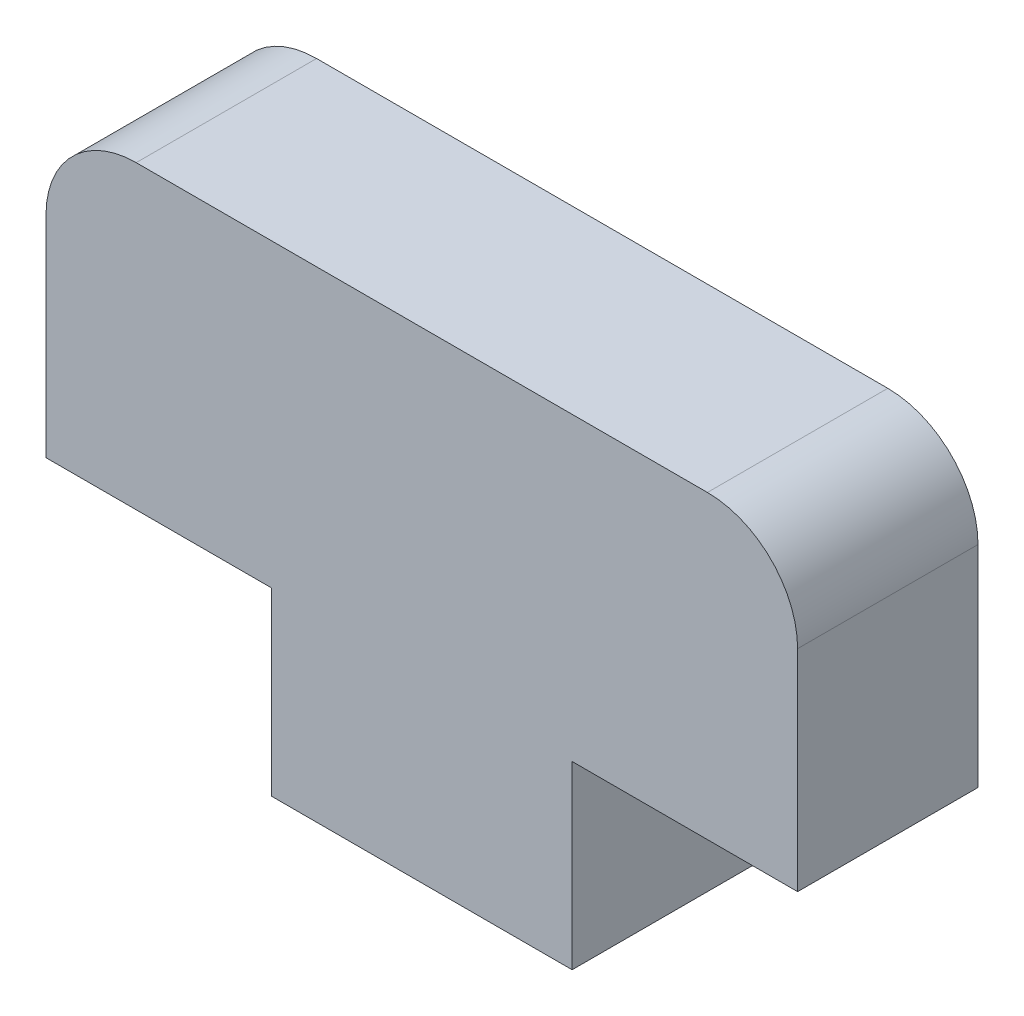
ISO-10303-21;
HEADER;
FILE_DESCRIPTION(('STEP AP214'),'2;1');
FILE_NAME('part.step','',(''),(''),'','','');
FILE_SCHEMA(('AUTOMOTIVE_DESIGN { 1 0 10303 214 1 1 1 1 }'));
ENDSEC;
DATA;
#1=APPLICATION_CONTEXT('core data for automotive mechanical design processes');
#2=APPLICATION_PROTOCOL_DEFINITION('international standard','automotive_design',2000,#1);
#3=PRODUCT_CONTEXT('',#1,'mechanical');
#4=PRODUCT('Part','Part','',(#3));
#5=PRODUCT_RELATED_PRODUCT_CATEGORY('part','',(#4));
#6=PRODUCT_DEFINITION_FORMATION('','',#4);
#7=PRODUCT_DEFINITION_CONTEXT('part definition',#1,'design');
#8=PRODUCT_DEFINITION('design','',#6,#7);
#9=PRODUCT_DEFINITION_SHAPE('','',#8);
#10=(LENGTH_UNIT() NAMED_UNIT(*) SI_UNIT(.MILLI.,.METRE.));
#11=(NAMED_UNIT(*) PLANE_ANGLE_UNIT() SI_UNIT($,.RADIAN.));
#12=(NAMED_UNIT(*) SI_UNIT($,.STERADIAN.) SOLID_ANGLE_UNIT());
#13=UNCERTAINTY_MEASURE_WITH_UNIT(LENGTH_MEASURE(1.E-05),#10,'distance_accuracy_value','');
#14=(GEOMETRIC_REPRESENTATION_CONTEXT(3) GLOBAL_UNCERTAINTY_ASSIGNED_CONTEXT((#13)) GLOBAL_UNIT_ASSIGNED_CONTEXT((#10,
#11,#12)) REPRESENTATION_CONTEXT('',''));
#15=CARTESIAN_POINT('',(0.,0.,0.));
#16=DIRECTION('',(0.,0.,1.));
#17=DIRECTION('',(1.,0.,0.));
#18=AXIS2_PLACEMENT_3D('',#15,#16,#17);
#19=CARTESIAN_POINT('',(12.5,5.,6.));
#20=DIRECTION('',(-1.,0.,0.));
#21=DIRECTION('',(0.,0.,1.));
#22=AXIS2_PLACEMENT_3D('',#19,#20,#21);
#23=PLANE('',#22);
#24=DIRECTION('',(0.,1.,0.));
#25=VECTOR('',#24,1.);
#26=CARTESIAN_POINT('',(12.5,5.,0.));
#27=LINE('',#26,#25);
#28=CARTESIAN_POINT('',(12.5,-5.,0.));
#29=VERTEX_POINT('',#28);
#30=CARTESIAN_POINT('',(12.5,2.,0.));
#31=VERTEX_POINT('',#30);
#32=EDGE_CURVE('E145',#29,#31,#27,.T.);
#33=ORIENTED_EDGE('',*,*,#32,.T.);
#34=DIRECTION('',(0.,0.,-1.));
#35=VECTOR('',#34,1.);
#36=CARTESIAN_POINT('',(12.5,2.,6.));
#37=LINE('',#36,#35);
#38=CARTESIAN_POINT('',(12.5,2.,6.));
#39=VERTEX_POINT('',#38);
#40=EDGE_CURVE('E56',#31,#39,#37,.F.);
#41=ORIENTED_EDGE('',*,*,#40,.T.);
#42=DIRECTION('',(0.,1.,0.));
#43=VECTOR('',#42,1.);
#44=CARTESIAN_POINT('',(12.5,5.,6.));
#45=LINE('',#44,#43);
#46=CARTESIAN_POINT('',(12.5,-5.,6.));
#47=VERTEX_POINT('',#46);
#48=EDGE_CURVE('E161',#47,#39,#45,.T.);
#49=ORIENTED_EDGE('',*,*,#48,.F.);
#50=DIRECTION('',(0.,0.,-1.));
#51=VECTOR('',#50,1.);
#52=CARTESIAN_POINT('',(12.5,-5.,6.));
#53=LINE('',#52,#51);
#54=EDGE_CURVE('E144',#47,#29,#53,.T.);
#55=ORIENTED_EDGE('',*,*,#54,.T.);
#56=EDGE_LOOP('',(#33,#41,#49,#55));
#57=FACE_BOUND('',#56,.T.);
#58=ADVANCED_FACE('F33',(#57),#23,.F.);
#59=CARTESIAN_POINT('',(-12.5,5.,6.));
#60=DIRECTION('',(0.,-1.,0.));
#61=DIRECTION('',(0.,0.,-1.));
#62=AXIS2_PLACEMENT_3D('',#59,#60,#61);
#63=PLANE('',#62);
#64=DIRECTION('',(-1.,0.,0.));
#65=VECTOR('',#64,1.);
#66=CARTESIAN_POINT('',(-12.5,5.,6.));
#67=LINE('',#66,#65);
#68=CARTESIAN_POINT('',(9.49999999999999,5.,6.));
#69=VERTEX_POINT('',#68);
#70=CARTESIAN_POINT('',(-9.50000000000001,5.,6.));
#71=VERTEX_POINT('',#70);
#72=EDGE_CURVE('E118',#69,#71,#67,.T.);
#73=ORIENTED_EDGE('',*,*,#72,.F.);
#74=DIRECTION('',(0.,0.,-1.));
#75=VECTOR('',#74,1.);
#76=CARTESIAN_POINT('',(9.49999999999999,5.,6.));
#77=LINE('',#76,#75);
#78=CARTESIAN_POINT('',(9.49999999999999,5.,0.));
#79=VERTEX_POINT('',#78);
#80=EDGE_CURVE('E175',#69,#79,#77,.T.);
#81=ORIENTED_EDGE('',*,*,#80,.T.);
#82=DIRECTION('',(-1.,0.,0.));
#83=VECTOR('',#82,1.);
#84=CARTESIAN_POINT('',(-12.5,5.,0.));
#85=LINE('',#84,#83);
#86=CARTESIAN_POINT('',(-9.50000000000001,5.,0.));
#87=VERTEX_POINT('',#86);
#88=EDGE_CURVE('E147',#79,#87,#85,.T.);
#89=ORIENTED_EDGE('',*,*,#88,.T.);
#90=DIRECTION('',(0.,0.,-1.));
#91=VECTOR('',#90,1.);
#92=CARTESIAN_POINT('',(-9.50000000000001,5.,6.));
#93=LINE('',#92,#91);
#94=EDGE_CURVE('E127',#87,#71,#93,.F.);
#95=ORIENTED_EDGE('',*,*,#94,.T.);
#96=EDGE_LOOP('',(#73,#81,#89,#95));
#97=FACE_BOUND('',#96,.T.);
#98=ADVANCED_FACE('F188',(#97),#63,.F.);
#99=CARTESIAN_POINT('',(-12.5,5.,6.));
#100=DIRECTION('',(1.,0.,0.));
#101=DIRECTION('',(0.,1.,0.));
#102=AXIS2_PLACEMENT_3D('',#99,#100,#101);
#103=PLANE('',#102);
#104=DIRECTION('',(0.,-1.,0.));
#105=VECTOR('',#104,1.);
#106=CARTESIAN_POINT('',(-12.5,5.,6.));
#107=LINE('',#106,#105);
#108=CARTESIAN_POINT('',(-12.5,2.,6.));
#109=VERTEX_POINT('',#108);
#110=CARTESIAN_POINT('',(-12.5,-5.,6.));
#111=VERTEX_POINT('',#110);
#112=EDGE_CURVE('E110',#109,#111,#107,.T.);
#113=ORIENTED_EDGE('',*,*,#112,.F.);
#114=DIRECTION('',(0.,0.,-1.));
#115=VECTOR('',#114,1.);
#116=CARTESIAN_POINT('',(-12.5,2.,6.));
#117=LINE('',#116,#115);
#118=CARTESIAN_POINT('',(-12.5,2.,0.));
#119=VERTEX_POINT('',#118);
#120=EDGE_CURVE('E11',#109,#119,#117,.T.);
#121=ORIENTED_EDGE('',*,*,#120,.T.);
#122=DIRECTION('',(0.,-1.,0.));
#123=VECTOR('',#122,1.);
#124=CARTESIAN_POINT('',(-12.5,5.,0.));
#125=LINE('',#124,#123);
#126=CARTESIAN_POINT('',(-12.5,-5.,0.));
#127=VERTEX_POINT('',#126);
#128=EDGE_CURVE('E124',#119,#127,#125,.T.);
#129=ORIENTED_EDGE('',*,*,#128,.T.);
#130=DIRECTION('',(0.,0.,-1.));
#131=VECTOR('',#130,1.);
#132=CARTESIAN_POINT('',(-12.5,-5.,6.));
#133=LINE('',#132,#131);
#134=EDGE_CURVE('E121',#111,#127,#133,.T.);
#135=ORIENTED_EDGE('',*,*,#134,.F.);
#136=EDGE_LOOP('',(#113,#121,#129,#135));
#137=FACE_BOUND('',#136,.T.);
#138=ADVANCED_FACE('F122',(#137),#103,.F.);
#139=CARTESIAN_POINT('',(-12.5,-5.,6.));
#140=DIRECTION('',(0.,1.,0.));
#141=DIRECTION('',(0.,0.,1.));
#142=AXIS2_PLACEMENT_3D('',#139,#140,#141);
#143=PLANE('',#142);
#144=DIRECTION('',(1.,0.,0.));
#145=VECTOR('',#144,1.);
#146=CARTESIAN_POINT('',(-12.5,-5.,0.));
#147=LINE('',#146,#145);
#148=CARTESIAN_POINT('',(-5.,-5.,0.));
#149=VERTEX_POINT('',#148);
#150=EDGE_CURVE('E151',#127,#149,#147,.T.);
#151=ORIENTED_EDGE('',*,*,#150,.T.);
#152=DIRECTION('',(0.,0.,-1.));
#153=VECTOR('',#152,1.);
#154=CARTESIAN_POINT('',(-5.,-5.,6.));
#155=LINE('',#154,#153);
#156=CARTESIAN_POINT('',(-5.,-5.,6.));
#157=VERTEX_POINT('',#156);
#158=EDGE_CURVE('E128',#157,#149,#155,.T.);
#159=ORIENTED_EDGE('',*,*,#158,.F.);
#160=DIRECTION('',(1.,0.,0.));
#161=VECTOR('',#160,1.);
#162=CARTESIAN_POINT('',(-12.5,-5.,6.));
#163=LINE('',#162,#161);
#164=EDGE_CURVE('E114',#111,#157,#163,.T.);
#165=ORIENTED_EDGE('',*,*,#164,.F.);
#166=ORIENTED_EDGE('',*,*,#134,.T.);
#167=EDGE_LOOP('',(#151,#159,#165,#166));
#168=FACE_BOUND('',#167,.T.);
#169=ADVANCED_FACE('F130',(#168),#143,.F.);
#170=CARTESIAN_POINT('',(-5.,-5.,6.));
#171=DIRECTION('',(1.,0.,0.));
#172=DIRECTION('',(0.,1.,0.));
#173=AXIS2_PLACEMENT_3D('',#170,#171,#172);
#174=PLANE('',#173);
#175=DIRECTION('',(0.,-1.,0.));
#176=VECTOR('',#175,1.);
#177=CARTESIAN_POINT('',(-5.,-5.,0.));
#178=LINE('',#177,#176);
#179=CARTESIAN_POINT('',(-5.,-11.,0.));
#180=VERTEX_POINT('',#179);
#181=EDGE_CURVE('E153',#149,#180,#178,.T.);
#182=ORIENTED_EDGE('',*,*,#181,.T.);
#183=DIRECTION('',(0.,0.,-1.));
#184=VECTOR('',#183,1.);
#185=CARTESIAN_POINT('',(-5.,-11.,6.));
#186=LINE('',#185,#184);
#187=CARTESIAN_POINT('',(-5.,-11.,6.));
#188=VERTEX_POINT('',#187);
#189=EDGE_CURVE('E170',#188,#180,#186,.T.);
#190=ORIENTED_EDGE('',*,*,#189,.F.);
#191=DIRECTION('',(0.,-1.,0.));
#192=VECTOR('',#191,1.);
#193=CARTESIAN_POINT('',(-5.,-5.,6.));
#194=LINE('',#193,#192);
#195=EDGE_CURVE('E133',#157,#188,#194,.T.);
#196=ORIENTED_EDGE('',*,*,#195,.F.);
#197=ORIENTED_EDGE('',*,*,#158,.T.);
#198=EDGE_LOOP('',(#182,#190,#196,#197));
#199=FACE_BOUND('',#198,.T.);
#200=ADVANCED_FACE('F213',(#199),#174,.F.);
#201=CARTESIAN_POINT('',(-5.,-11.,6.));
#202=DIRECTION('',(0.,1.,0.));
#203=DIRECTION('',(-1.,0.,0.));
#204=AXIS2_PLACEMENT_3D('',#201,#202,#203);
#205=PLANE('',#204);
#206=DIRECTION('',(1.,0.,0.));
#207=VECTOR('',#206,1.);
#208=CARTESIAN_POINT('',(-5.,-11.,0.));
#209=LINE('',#208,#207);
#210=CARTESIAN_POINT('',(5.,-11.,0.));
#211=VERTEX_POINT('',#210);
#212=EDGE_CURVE('E155',#180,#211,#209,.T.);
#213=ORIENTED_EDGE('',*,*,#212,.T.);
#214=DIRECTION('',(0.,0.,-1.));
#215=VECTOR('',#214,1.);
#216=CARTESIAN_POINT('',(5.,-11.,6.));
#217=LINE('',#216,#215);
#218=CARTESIAN_POINT('',(5.,-11.,6.));
#219=VERTEX_POINT('',#218);
#220=EDGE_CURVE('E167',#219,#211,#217,.T.);
#221=ORIENTED_EDGE('',*,*,#220,.F.);
#222=DIRECTION('',(1.,0.,0.));
#223=VECTOR('',#222,1.);
#224=CARTESIAN_POINT('',(-5.,-11.,6.));
#225=LINE('',#224,#223);
#226=EDGE_CURVE('E135',#188,#219,#225,.T.);
#227=ORIENTED_EDGE('',*,*,#226,.F.);
#228=ORIENTED_EDGE('',*,*,#189,.T.);
#229=EDGE_LOOP('',(#213,#221,#227,#228));
#230=FACE_BOUND('',#229,.T.);
#231=ADVANCED_FACE('F210',(#230),#205,.F.);
#232=CARTESIAN_POINT('',(5.,-5.,6.));
#233=DIRECTION('',(-1.,0.,0.));
#234=DIRECTION('',(0.,-1.,0.));
#235=AXIS2_PLACEMENT_3D('',#232,#233,#234);
#236=PLANE('',#235);
#237=DIRECTION('',(0.,1.,0.));
#238=VECTOR('',#237,1.);
#239=CARTESIAN_POINT('',(5.,-5.,0.));
#240=LINE('',#239,#238);
#241=CARTESIAN_POINT('',(5.,-5.,0.));
#242=VERTEX_POINT('',#241);
#243=EDGE_CURVE('E157',#211,#242,#240,.T.);
#244=ORIENTED_EDGE('',*,*,#243,.T.);
#245=DIRECTION('',(0.,0.,-1.));
#246=VECTOR('',#245,1.);
#247=CARTESIAN_POINT('',(5.,-5.,6.));
#248=LINE('',#247,#246);
#249=CARTESIAN_POINT('',(5.,-5.,6.));
#250=VERTEX_POINT('',#249);
#251=EDGE_CURVE('E164',#250,#242,#248,.T.);
#252=ORIENTED_EDGE('',*,*,#251,.F.);
#253=DIRECTION('',(0.,1.,0.));
#254=VECTOR('',#253,1.);
#255=CARTESIAN_POINT('',(5.,-5.,6.));
#256=LINE('',#255,#254);
#257=EDGE_CURVE('E140',#219,#250,#256,.T.);
#258=ORIENTED_EDGE('',*,*,#257,.F.);
#259=ORIENTED_EDGE('',*,*,#220,.T.);
#260=EDGE_LOOP('',(#244,#252,#258,#259));
#261=FACE_BOUND('',#260,.T.);
#262=ADVANCED_FACE('F205',(#261),#236,.F.);
#263=CARTESIAN_POINT('',(5.,-5.,6.));
#264=DIRECTION('',(0.,1.,0.));
#265=DIRECTION('',(0.,0.,1.));
#266=AXIS2_PLACEMENT_3D('',#263,#264,#265);
#267=PLANE('',#266);
#268=DIRECTION('',(1.,0.,0.));
#269=VECTOR('',#268,1.);
#270=CARTESIAN_POINT('',(5.,-5.,0.));
#271=LINE('',#270,#269);
#272=EDGE_CURVE('E159',#242,#29,#271,.T.);
#273=ORIENTED_EDGE('',*,*,#272,.T.);
#274=ORIENTED_EDGE('',*,*,#54,.F.);
#275=DIRECTION('',(1.,0.,0.));
#276=VECTOR('',#275,1.);
#277=CARTESIAN_POINT('',(5.,-5.,6.));
#278=LINE('',#277,#276);
#279=EDGE_CURVE('E142',#250,#47,#278,.T.);
#280=ORIENTED_EDGE('',*,*,#279,.F.);
#281=ORIENTED_EDGE('',*,*,#251,.T.);
#282=EDGE_LOOP('',(#273,#274,#280,#281));
#283=FACE_BOUND('',#282,.T.);
#284=ADVANCED_FACE('F199',(#283),#267,.F.);
#285=CARTESIAN_POINT('',(0.,0.,6.));
#286=DIRECTION('',(0.,0.,1.));
#287=DIRECTION('',(1.,0.,0.));
#288=AXIS2_PLACEMENT_3D('',#285,#286,#287);
#289=PLANE('',#288);
#290=ORIENTED_EDGE('',*,*,#48,.T.);
#291=CARTESIAN_POINT('',(9.49999999999999,2.,6.));
#292=DIRECTION('',(0.,0.,1.));
#293=DIRECTION('',(1.,0.,0.));
#294=AXIS2_PLACEMENT_3D('',#291,#292,#293);
#295=CIRCLE('',#294,3.);
#296=EDGE_CURVE('E41',#39,#69,#295,.T.);
#297=ORIENTED_EDGE('',*,*,#296,.T.);
#298=ORIENTED_EDGE('',*,*,#72,.T.);
#299=CARTESIAN_POINT('',(-9.50000000000001,2.,6.));
#300=DIRECTION('',(0.,0.,1.));
#301=DIRECTION('',(1.,0.,0.));
#302=AXIS2_PLACEMENT_3D('',#299,#300,#301);
#303=CIRCLE('',#302,3.);
#304=EDGE_CURVE('E48',#71,#109,#303,.T.);
#305=ORIENTED_EDGE('',*,*,#304,.T.);
#306=ORIENTED_EDGE('',*,*,#112,.T.);
#307=ORIENTED_EDGE('',*,*,#164,.T.);
#308=ORIENTED_EDGE('',*,*,#195,.T.);
#309=ORIENTED_EDGE('',*,*,#226,.T.);
#310=ORIENTED_EDGE('',*,*,#257,.T.);
#311=ORIENTED_EDGE('',*,*,#279,.T.);
#312=EDGE_LOOP('',(#290,#297,#298,#305,#306,#307,#308,#309,#310,#311));
#313=FACE_BOUND('',#312,.T.);
#314=ADVANCED_FACE('F112',(#313),#289,.T.);
#315=CARTESIAN_POINT('',(0.,0.,0.));
#316=DIRECTION('',(0.,0.,1.));
#317=DIRECTION('',(1.,0.,0.));
#318=AXIS2_PLACEMENT_3D('',#315,#316,#317);
#319=PLANE('',#318);
#320=ORIENTED_EDGE('',*,*,#88,.F.);
#321=CARTESIAN_POINT('',(9.49999999999999,2.,0.));
#322=DIRECTION('',(0.,0.,1.));
#323=DIRECTION('',(1.,0.,0.));
#324=AXIS2_PLACEMENT_3D('',#321,#322,#323);
#325=CIRCLE('',#324,3.);
#326=EDGE_CURVE('E180',#79,#31,#325,.F.);
#327=ORIENTED_EDGE('',*,*,#326,.T.);
#328=ORIENTED_EDGE('',*,*,#32,.F.);
#329=ORIENTED_EDGE('',*,*,#272,.F.);
#330=ORIENTED_EDGE('',*,*,#243,.F.);
#331=ORIENTED_EDGE('',*,*,#212,.F.);
#332=ORIENTED_EDGE('',*,*,#181,.F.);
#333=ORIENTED_EDGE('',*,*,#150,.F.);
#334=ORIENTED_EDGE('',*,*,#128,.F.);
#335=CARTESIAN_POINT('',(-9.50000000000001,2.,0.));
#336=DIRECTION('',(0.,0.,1.));
#337=DIRECTION('',(1.,0.,0.));
#338=AXIS2_PLACEMENT_3D('',#335,#336,#337);
#339=CIRCLE('',#338,3.);
#340=EDGE_CURVE('E178',#119,#87,#339,.F.);
#341=ORIENTED_EDGE('',*,*,#340,.T.);
#342=EDGE_LOOP('',(#320,#327,#328,#329,#330,#331,#332,#333,#334,#341));
#343=FACE_BOUND('',#342,.T.);
#344=ADVANCED_FACE('F194',(#343),#319,.F.);
#345=CARTESIAN_POINT('',(9.49999999999999,2.,6.));
#346=DIRECTION('',(0.,0.,-1.));
#347=DIRECTION('',(-1.,0.,0.));
#348=AXIS2_PLACEMENT_3D('',#345,#346,#347);
#349=CYLINDRICAL_SURFACE('',#348,3.);
#350=ORIENTED_EDGE('',*,*,#296,.F.);
#351=ORIENTED_EDGE('',*,*,#40,.F.);
#352=ORIENTED_EDGE('',*,*,#326,.F.);
#353=ORIENTED_EDGE('',*,*,#80,.F.);
#354=EDGE_LOOP('',(#350,#351,#352,#353));
#355=FACE_BOUND('',#354,.T.);
#356=ADVANCED_FACE('F191',(#355),#349,.T.);
#357=CARTESIAN_POINT('',(-9.50000000000001,2.,6.));
#358=DIRECTION('',(0.,0.,-1.));
#359=DIRECTION('',(-1.,0.,0.));
#360=AXIS2_PLACEMENT_3D('',#357,#358,#359);
#361=CYLINDRICAL_SURFACE('',#360,3.);
#362=ORIENTED_EDGE('',*,*,#304,.F.);
#363=ORIENTED_EDGE('',*,*,#94,.F.);
#364=ORIENTED_EDGE('',*,*,#340,.F.);
#365=ORIENTED_EDGE('',*,*,#120,.F.);
#366=EDGE_LOOP('',(#362,#363,#364,#365));
#367=FACE_BOUND('',#366,.T.);
#368=ADVANCED_FACE('F35',(#367),#361,.T.);
#369=CLOSED_SHELL('',(#58,#98,#138,#169,#200,#231,#262,#284,#314,#344,#356,#368));
#370=MANIFOLD_SOLID_BREP('B2',#369);
#371=ADVANCED_BREP_SHAPE_REPRESENTATION('',(#18,#370),#14);
#372=SHAPE_DEFINITION_REPRESENTATION(#9,#371);
ENDSEC;
END-ISO-10303-21;
